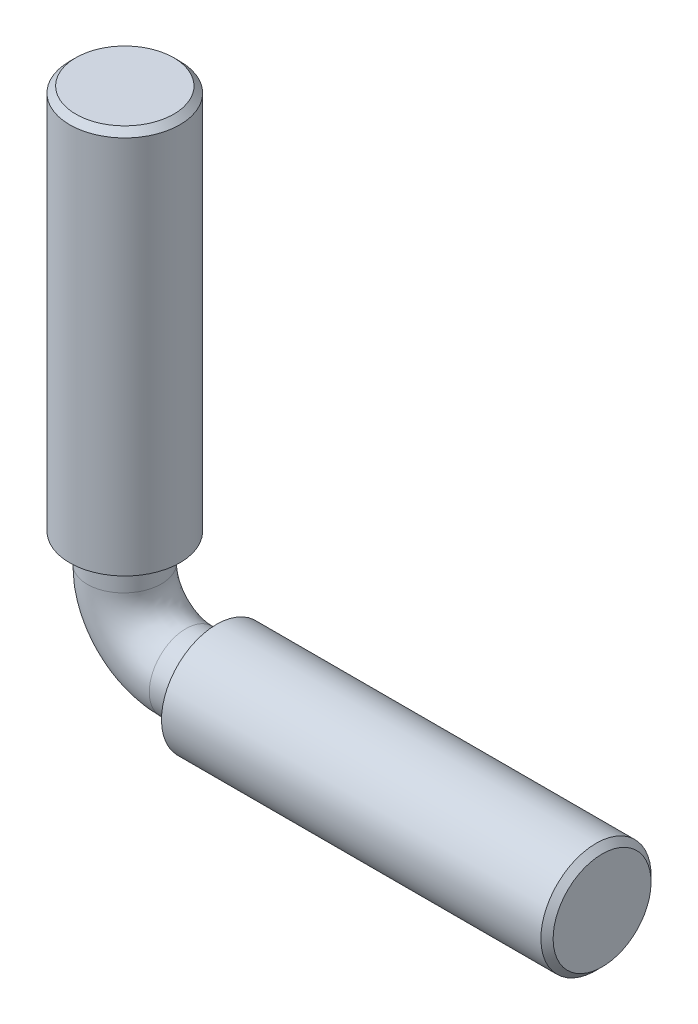
ISO-10303-21;
HEADER;
FILE_DESCRIPTION(('STEP AP214'),'2;1');
FILE_NAME('part.step','',(''),(''),'','','');
FILE_SCHEMA(('AUTOMOTIVE_DESIGN { 1 0 10303 214 1 1 1 1 }'));
ENDSEC;
DATA;
#1=APPLICATION_CONTEXT('core data for automotive mechanical design processes');
#2=APPLICATION_PROTOCOL_DEFINITION('international standard','automotive_design',2000,#1);
#3=PRODUCT_CONTEXT('',#1,'mechanical');
#4=PRODUCT('Part','Part','',(#3));
#5=PRODUCT_RELATED_PRODUCT_CATEGORY('part','',(#4));
#6=PRODUCT_DEFINITION_FORMATION('','',#4);
#7=PRODUCT_DEFINITION_CONTEXT('part definition',#1,'design');
#8=PRODUCT_DEFINITION('design','',#6,#7);
#9=PRODUCT_DEFINITION_SHAPE('','',#8);
#10=(LENGTH_UNIT() NAMED_UNIT(*) SI_UNIT(.MILLI.,.METRE.));
#11=(NAMED_UNIT(*) PLANE_ANGLE_UNIT() SI_UNIT($,.RADIAN.));
#12=(NAMED_UNIT(*) SI_UNIT($,.STERADIAN.) SOLID_ANGLE_UNIT());
#13=UNCERTAINTY_MEASURE_WITH_UNIT(LENGTH_MEASURE(1.E-05),#10,'distance_accuracy_value','');
#14=(GEOMETRIC_REPRESENTATION_CONTEXT(3) GLOBAL_UNCERTAINTY_ASSIGNED_CONTEXT((#13)) GLOBAL_UNIT_ASSIGNED_CONTEXT((#10,
#11,#12)) REPRESENTATION_CONTEXT('',''));
#15=CARTESIAN_POINT('',(0.,0.,0.));
#16=DIRECTION('',(0.,0.,1.));
#17=DIRECTION('',(1.,0.,0.));
#18=AXIS2_PLACEMENT_3D('',#15,#16,#17);
#19=CARTESIAN_POINT('',(-0.992744360204768,38.8467789270018,0.));
#20=DIRECTION('',(0.,-1.,0.));
#21=DIRECTION('',(0.,0.,-1.));
#22=AXIS2_PLACEMENT_3D('',#19,#20,#21);
#23=CYLINDRICAL_SURFACE('',#22,3.);
#24=CARTESIAN_POINT('',(-0.992744360204768,6.34677892700181,0.));
#25=DIRECTION('',(0.,1.,0.));
#26=DIRECTION('',(0.,0.,1.));
#27=AXIS2_PLACEMENT_3D('',#24,#25,#26);
#28=CIRCLE('',#27,3.);
#29=CARTESIAN_POINT('',(-0.992744360204768,6.34677892700181,3.));
#30=VERTEX_POINT('',#29);
#31=EDGE_CURVE('E64',#30,#30,#28,.F.);
#32=ORIENTED_EDGE('',*,*,#31,.T.);
#33=EDGE_LOOP('',(#32));
#34=FACE_BOUND('',#33,.T.);
#35=CARTESIAN_POINT('',(-0.996744360204768,5.046738923001,-3.));
#36=CARTESIAN_POINT('',(5.00205551977122,5.166738923001,-3.));
#37=CARTESIAN_POINT('',(5.00205551977122,5.166738923001,3.));
#38=CARTESIAN_POINT('',(-0.996744360204768,5.046738923001,3.));
#39=CARTESIAN_POINT('',(-6.99554424018076,4.92673892300101,3.));
#40=CARTESIAN_POINT('',(-6.99554424018076,4.92673892300101,-3.));
#41=CARTESIAN_POINT('',(-0.996744360204768,5.046738923001,-3.));
#42=(BOUNDED_CURVE() B_SPLINE_CURVE(3,(#35,#36,#37,#38,#39,#40,#41),.UNSPECIFIED.,.T.,
.F.) B_SPLINE_CURVE_WITH_KNOTS((4,3,4),(0.,0.5,1.),
.UNSPECIFIED.) CURVE() GEOMETRIC_REPRESENTATION_ITEM() RATIONAL_B_SPLINE_CURVE((1.,
0.333333333333333,0.333333333333333,1.,0.333333333333333,0.333333333333333,1.)) REPRESENTATION_ITEM(''));
#43=CARTESIAN_POINT('',(-0.996744360204768,5.046738923001,-3.));
#44=VERTEX_POINT('',#43);
#45=EDGE_CURVE('E81',#44,#44,#42,.T.);
#46=ORIENTED_EDGE('',*,*,#45,.F.);
#47=EDGE_LOOP('',(#46));
#48=FACE_BOUND('',#47,.T.);
#49=ADVANCED_FACE('F49',(#34,#48),#23,.T.);
#50=CARTESIAN_POINT('',(4.00625553977522,-0.0532210729981999,0.));
#51=DIRECTION('',(1.,0.,0.));
#52=DIRECTION('',(0.,0.,-1.));
#53=AXIS2_PLACEMENT_3D('',#50,#51,#52);
#54=CYLINDRICAL_SURFACE('',#53,3.);
#55=CARTESIAN_POINT('',(5.50625553977522,-0.0532210729981999,0.));
#56=DIRECTION('',(1.,0.,0.));
#57=DIRECTION('',(0.,1.,0.));
#58=AXIS2_PLACEMENT_3D('',#55,#56,#57);
#59=CIRCLE('',#58,3.);
#60=CARTESIAN_POINT('',(5.50625553977522,2.9467789270018,0.));
#61=VERTEX_POINT('',#60);
#62=EDGE_CURVE('E56',#61,#61,#59,.F.);
#63=ORIENTED_EDGE('',*,*,#62,.T.);
#64=EDGE_LOOP('',(#63));
#65=FACE_BOUND('',#64,.T.);
#66=CARTESIAN_POINT('',(4.00625553977522,-0.0532210729982008,0.));
#67=DIRECTION('',(1.,0.,0.));
#68=DIRECTION('',(0.,0.,-1.));
#69=AXIS2_PLACEMENT_3D('',#66,#67,#68);
#70=CIRCLE('',#69,3.);
#71=CARTESIAN_POINT('',(4.00625553977522,-0.0532210729982008,-3.));
#72=VERTEX_POINT('',#71);
#73=EDGE_CURVE('E85',#72,#72,#70,.T.);
#74=ORIENTED_EDGE('',*,*,#73,.T.);
#75=EDGE_LOOP('',(#74));
#76=FACE_BOUND('',#75,.T.);
#77=ADVANCED_FACE('F120',(#65,#76),#54,.T.);
#78=CARTESIAN_POINT('',(-0.996744360204768,5.046738923001,-3.));
#79=CARTESIAN_POINT('',(-0.996077693538109,5.01341225700087,-3.));
#80=CARTESIAN_POINT('',(-0.995411026871435,4.9800855910013,-3.));
#81=CARTESIAN_POINT('',(-0.994077693538102,4.9134322590015,-3.));
#82=CARTESIAN_POINT('',(-0.993412692236004,4.88010551171974,-3.));
#83=CARTESIAN_POINT('',(-0.992338417192119,4.82653645234937,-3.));
#84=CARTESIAN_POINT('',(-0.99181161526621,4.80629986845965,-3.));
#85=CARTESIAN_POINT('',(-0.99051052793411,4.76584104542199,-3.));
#86=CARTESIAN_POINT('',(-0.989737253905981,4.7456187564067,-3.));
#87=CARTESIAN_POINT('',(-0.987049702214601,4.68497671946215,-3.));
#88=CARTESIAN_POINT('',(-0.984767689786718,4.64458178020716,-3.));
#89=CARTESIAN_POINT('',(-0.976454543156447,4.52352462452086,-3.));
#90=CARTESIAN_POINT('',(-0.96895615855109,4.4429897814016,-3.));
#91=CARTESIAN_POINT('',(-0.94062654341767,4.20213307724187,-3.));
#92=CARTESIAN_POINT('',(-0.913956983318341,4.04255573665904,-3.));
#93=CARTESIAN_POINT('',(-0.810980769889759,3.56885376984692,-3.));
#94=CARTESIAN_POINT('',(-0.711621302984798,3.25976193540355,-3.));
#95=CARTESIAN_POINT('',(-0.327091327403664,2.37002556988227,-3.));
#96=CARTESIAN_POINT('',(0.0448025419734594,1.82837912246072,-3.));
#97=CARTESIAN_POINT('',(0.967708537576984,0.923750303000047,-3.));
#98=CARTESIAN_POINT('',(1.51730739543483,0.562341817213447,-3.));
#99=CARTESIAN_POINT('',(2.4152873986878,0.195636087349619,-3.));
#100=CARTESIAN_POINT('',(2.72647403433992,0.102554368346032,-3.));
#101=CARTESIAN_POINT('',(3.20195992093775,0.00924952183073729,-3.));
#102=CARTESIAN_POINT('',(3.36190581229895,-0.0141562965807287,-3.));
#103=CARTESIAN_POINT('',(3.60293939398161,-0.0375818447056896,-3.));
#104=CARTESIAN_POINT('',(3.68347065392838,-0.0434442577274419,-3.));
#105=CARTESIAN_POINT('',(3.80442525795303,-0.0493089341409013,-3.));
#106=CARTESIAN_POINT('',(3.84476982685467,-0.0507757101745176,-3.));
#107=CARTESIAN_POINT('',(3.90531170014163,-0.0522427610827665,-3.));
#108=CARTESIAN_POINT('',(3.92549650059518,-0.0526095940763061,-3.));
#109=CARTESIAN_POINT('',(3.96587209858892,-0.0530987499693647,-3.));
#110=CARTESIAN_POINT('',(3.98606289663431,-0.0532210729981999,-3.));
#111=CARTESIAN_POINT('',(4.00625553977522,-0.0532210729981999,-3.));
#112=CARTESIAN_POINT('',(5.00205551977122,5.166738923001,-3.));
#113=CARTESIAN_POINT('',(5.00272218643789,5.13341225700087,-3.));
#114=CARTESIAN_POINT('',(5.00338885310456,5.1000855910013,-3.));
#115=CARTESIAN_POINT('',(5.00472218643789,5.0334322590015,-3.));
#116=CARTESIAN_POINT('',(5.00578918617745,4.98010960965793,-3.));
#117=CARTESIAN_POINT('',(5.00621729005362,4.95868190751871,-3.));
#118=CARTESIAN_POINT('',(5.00586897078351,4.97487473871027,-3.));
#119=CARTESIAN_POINT('',(5.0056087533171,4.98296650331772,-3.));
#120=CARTESIAN_POINT('',(5.00545409851148,4.98701096112073,-3.));
#121=CARTESIAN_POINT('',(5.00491658817316,4.99913936850995,-3.));
#122=CARTESIAN_POINT('',(5.00446018568756,5.00721835636088,-3.));
#123=CARTESIAN_POINT('',(5.00279755636167,5.03142978749772,-3.));
#124=CARTESIAN_POINT('',(5.00129787944049,5.04753675612174,-3.));
#125=CARTESIAN_POINT('',(4.99563195641381,5.09570809695402,-3.));
#126=CARTESIAN_POINT('',(4.99029804439406,5.12762356507052,-3.));
#127=CARTESIAN_POINT('',(4.96970280170798,5.22236395843244,-3.));
#128=CARTESIAN_POINT('',(4.94983090832712,5.2841823253209,-3.));
#129=CARTESIAN_POINT('',(4.87292491321123,5.46212959842683,-3.));
#130=CARTESIAN_POINT('',(4.79854613933334,5.57045888791025,-3.));
#131=CARTESIAN_POINT('',(4.61396494021711,5.75138465180193,-3.));
#132=CARTESIAN_POINT('',(4.50404516864195,5.82366634896059,-3.));
#133=CARTESIAN_POINT('',(4.32444916799337,5.89700749493168,-3.));
#134=CARTESIAN_POINT('',(4.26221184086239,5.91562383873281,-3.));
#135=CARTESIAN_POINT('',(4.16711466354266,5.93428480803608,-3.));
#136=CARTESIAN_POINT('',(4.13512548527064,5.93896597171824,-3.));
#137=CARTESIAN_POINT('',(4.08691876893386,5.94365108134333,-3.));
#138=CARTESIAN_POINT('',(4.07081251694473,5.94482356394766,-3.));
#139=CARTESIAN_POINT('',(4.04662159613959,5.94599649923033,-3.));
#140=CARTESIAN_POINT('',(4.03855268235945,5.94628985443707,-3.));
#141=CARTESIAN_POINT('',(4.02644430770189,5.94658326461871,-3.));
#142=CARTESIAN_POINT('',(4.02240734761121,5.94665663121743,-3.));
#143=CARTESIAN_POINT('',(4.01433222801252,5.94675446239602,-3.));
#144=CARTESIAN_POINT('',(3.99817848251886,5.9467789270018,-3.));
#145=CARTESIAN_POINT('',(4.00625553977522,5.9467789270018,-3.));
#146=CARTESIAN_POINT('',(5.00205551977122,5.166738923001,3.));
#147=CARTESIAN_POINT('',(5.00272218643789,5.13341225700087,3.));
#148=CARTESIAN_POINT('',(5.00338885310456,5.1000855910013,3.));
#149=CARTESIAN_POINT('',(5.00472218643789,5.0334322590015,3.));
#150=CARTESIAN_POINT('',(5.00578918617745,4.98010960965793,3.));
#151=CARTESIAN_POINT('',(5.00621729005362,4.95868190751871,3.));
#152=CARTESIAN_POINT('',(5.00586897078351,4.97487473871027,3.));
#153=CARTESIAN_POINT('',(5.0056087533171,4.98296650331772,3.));
#154=CARTESIAN_POINT('',(5.00545409851148,4.98701096112073,3.));
#155=CARTESIAN_POINT('',(5.00491658817316,4.99913936850995,3.));
#156=CARTESIAN_POINT('',(5.00446018568758,5.00721835636088,3.));
#157=CARTESIAN_POINT('',(5.00279755636163,5.03142978749772,3.));
#158=CARTESIAN_POINT('',(5.00129787944049,5.04753675612174,3.));
#159=CARTESIAN_POINT('',(4.99563195641381,5.09570809695402,3.));
#160=CARTESIAN_POINT('',(4.99029804439406,5.12762356507052,3.));
#161=CARTESIAN_POINT('',(4.96970280170798,5.22236395843244,3.));
#162=CARTESIAN_POINT('',(4.94983090832712,5.2841823253209,3.));
#163=CARTESIAN_POINT('',(4.87292491321123,5.46212959842683,3.));
#164=CARTESIAN_POINT('',(4.79854613933334,5.57045888791025,3.));
#165=CARTESIAN_POINT('',(4.61396494021711,5.75138465180193,3.));
#166=CARTESIAN_POINT('',(4.50404516864195,5.82366634896059,3.));
#167=CARTESIAN_POINT('',(4.32444916799337,5.89700749493168,3.));
#168=CARTESIAN_POINT('',(4.26221184086239,5.91562383873281,3.));
#169=CARTESIAN_POINT('',(4.16711466354266,5.93428480803608,3.));
#170=CARTESIAN_POINT('',(4.13512548527064,5.93896597171824,3.));
#171=CARTESIAN_POINT('',(4.08691876893386,5.94365108134333,3.));
#172=CARTESIAN_POINT('',(4.07081251694473,5.94482356394766,3.));
#173=CARTESIAN_POINT('',(4.04662159613959,5.94599649923033,3.));
#174=CARTESIAN_POINT('',(4.03855268235945,5.94628985443707,3.));
#175=CARTESIAN_POINT('',(4.02644430770189,5.94658326461871,3.));
#176=CARTESIAN_POINT('',(4.02240734761121,5.94665663121743,3.));
#177=CARTESIAN_POINT('',(4.01433222801252,5.94675446239602,3.));
#178=CARTESIAN_POINT('',(3.99817848251886,5.9467789270018,3.));
#179=CARTESIAN_POINT('',(4.00625553977522,5.9467789270018,3.));
#180=CARTESIAN_POINT('',(-0.996744360204768,5.046738923001,3.));
#181=CARTESIAN_POINT('',(-0.996077693538109,5.01341225700087,3.));
#182=CARTESIAN_POINT('',(-0.995411026871434,4.9800855910013,3.));
#183=CARTESIAN_POINT('',(-0.994077693538102,4.9134322590015,3.));
#184=CARTESIAN_POINT('',(-0.993412692236003,4.88010551171974,3.));
#185=CARTESIAN_POINT('',(-0.992338417192119,4.82653645234937,3.));
#186=CARTESIAN_POINT('',(-0.991811615266205,4.80629986845965,3.));
#187=CARTESIAN_POINT('',(-0.990510527934114,4.76584104542199,3.));
#188=CARTESIAN_POINT('',(-0.989737253905981,4.7456187564067,3.));
#189=CARTESIAN_POINT('',(-0.987049702214601,4.68497671946215,3.));
#190=CARTESIAN_POINT('',(-0.9847676897867,4.64458178020716,3.));
#191=CARTESIAN_POINT('',(-0.976454543156482,4.52352462452086,3.));
#192=CARTESIAN_POINT('',(-0.968956158551089,4.4429897814016,3.));
#193=CARTESIAN_POINT('',(-0.940626543417669,4.20213307724187,3.));
#194=CARTESIAN_POINT('',(-0.913956983318341,4.04255573665904,3.));
#195=CARTESIAN_POINT('',(-0.810980769889759,3.56885376984692,3.));
#196=CARTESIAN_POINT('',(-0.711621302984798,3.25976193540355,3.));
#197=CARTESIAN_POINT('',(-0.327091327403664,2.37002556988227,3.));
#198=CARTESIAN_POINT('',(0.0448025419734629,1.82837912246072,3.));
#199=CARTESIAN_POINT('',(0.967708537576987,0.923750303000047,3.));
#200=CARTESIAN_POINT('',(1.51730739543483,0.562341817213447,3.));
#201=CARTESIAN_POINT('',(2.4152873986878,0.195636087349619,3.));
#202=CARTESIAN_POINT('',(2.72647403433992,0.102554368346032,3.));
#203=CARTESIAN_POINT('',(3.20195992093775,0.00924952183073729,3.));
#204=CARTESIAN_POINT('',(3.36190581229895,-0.0141562965807282,3.));
#205=CARTESIAN_POINT('',(3.60293939398161,-0.0375818447056892,3.));
#206=CARTESIAN_POINT('',(3.68347065392838,-0.0434442577274414,3.));
#207=CARTESIAN_POINT('',(3.80442525795303,-0.0493089341409008,3.));
#208=CARTESIAN_POINT('',(3.84476982685467,-0.0507757101745172,3.));
#209=CARTESIAN_POINT('',(3.90531170014163,-0.0522427610827661,3.));
#210=CARTESIAN_POINT('',(3.92549650059518,-0.0526095940763057,3.));
#211=CARTESIAN_POINT('',(3.96587209858892,-0.0530987499693642,3.));
#212=CARTESIAN_POINT('',(3.98606289663431,-0.0532210729981995,3.));
#213=CARTESIAN_POINT('',(4.00625553977522,-0.0532210729981995,3.));
#214=CARTESIAN_POINT('',(-6.99554424018076,4.92673892300101,3.));
#215=CARTESIAN_POINT('',(-6.99487757351411,4.89341225700088,3.));
#216=CARTESIAN_POINT('',(-6.99421090684743,4.86008559100131,3.));
#217=CARTESIAN_POINT('',(-6.9928775735141,4.79343225900151,3.));
#218=CARTESIAN_POINT('',(-6.99261457064946,4.78010141378154,3.));
#219=CARTESIAN_POINT('',(-6.99089412443786,4.69439099718004,3.));
#220=CARTESIAN_POINT('',(-6.98949220131592,4.63772499820902,3.));
#221=CARTESIAN_POINT('',(-6.98662980918532,4.54871558752626,3.));
#222=CARTESIAN_POINT('',(-6.98492860632344,4.50422655169267,3.));
#223=CARTESIAN_POINT('',(-6.97901599260237,4.37081407041435,3.));
#224=CARTESIAN_POINT('',(-6.97399556526098,4.28194520405343,3.));
#225=CARTESIAN_POINT('',(-6.95570664267459,4.01561946154402,3.));
#226=CARTESIAN_POINT('',(-6.93921019654267,3.83844280668146,3.));
#227=CARTESIAN_POINT('',(-6.87688504324914,3.30855805752972,3.));
#228=CARTESIAN_POINT('',(-6.81821201103074,2.95748790824755,3.));
#229=CARTESIAN_POINT('',(-6.5916643414875,1.9153435812614,3.));
#230=CARTESIAN_POINT('',(-6.37307351429671,1.2353415454862,3.));
#231=CARTESIAN_POINT('',(-5.52710756801855,-0.722078458662294,3.));
#232=CARTESIAN_POINT('',(-4.70894105538641,-1.91370064298882,3.));
#233=CARTESIAN_POINT('',(-2.67854786506314,-3.90388404580184,3.));
#234=CARTESIAN_POINT('',(-1.4694303777723,-4.6989827145337,3.));
#235=CARTESIAN_POINT('',(0.506125629382229,-5.50573532023244,3.));
#236=CARTESIAN_POINT('',(1.19073622781744,-5.71051510204075,3.));
#237=CARTESIAN_POINT('',(2.23680517833285,-5.91578576437461,3.));
#238=CARTESIAN_POINT('',(2.58868613932726,-5.9672785648797,3.));
#239=CARTESIAN_POINT('',(3.11896001902936,-6.01881477075471,3.));
#240=CARTESIAN_POINT('',(3.29612879091204,-6.03171207940255,3.));
#241=CARTESIAN_POINT('',(3.56222891976648,-6.04461436751213,3.));
#242=CARTESIAN_POINT('',(3.65098697134988,-6.0478412747861,3.));
#243=CARTESIAN_POINT('',(3.78417909258138,-6.05106878678424,3.));
#244=CARTESIAN_POINT('',(3.82858565357915,-6.05187581937005,3.));
#245=CARTESIAN_POINT('',(3.91741196916533,-6.05295196233475,3.));
#246=CARTESIAN_POINT('',(3.97394731074977,-6.0532210729982,3.));
#247=CARTESIAN_POINT('',(4.00625553977522,-6.0532210729982,3.));
#248=CARTESIAN_POINT('',(-6.99554424018076,4.92673892300101,-3.));
#249=CARTESIAN_POINT('',(-6.99487757351411,4.89341225700088,-3.));
#250=CARTESIAN_POINT('',(-6.99421090684743,4.86008559100131,-3.));
#251=CARTESIAN_POINT('',(-6.9928775735141,4.79343225900151,-3.));
#252=CARTESIAN_POINT('',(-6.99261457064946,4.78010141378154,-3.));
#253=CARTESIAN_POINT('',(-6.99089412443786,4.69439099718004,-3.));
#254=CARTESIAN_POINT('',(-6.98949220131593,4.63772499820902,-3.));
#255=CARTESIAN_POINT('',(-6.98662980918532,4.54871558752626,-3.));
#256=CARTESIAN_POINT('',(-6.98492860632344,4.50422655169267,-3.));
#257=CARTESIAN_POINT('',(-6.97901599260237,4.37081407041435,-3.));
#258=CARTESIAN_POINT('',(-6.973995565261,4.28194520405343,-3.));
#259=CARTESIAN_POINT('',(-6.95570664267456,4.01561946154402,-3.));
#260=CARTESIAN_POINT('',(-6.93921019654267,3.83844280668146,-3.));
#261=CARTESIAN_POINT('',(-6.87688504324914,3.30855805752972,-3.));
#262=CARTESIAN_POINT('',(-6.81821201103074,2.95748790824755,-3.));
#263=CARTESIAN_POINT('',(-6.5916643414875,1.9153435812614,-3.));
#264=CARTESIAN_POINT('',(-6.37307351429671,1.2353415454862,-3.));
#265=CARTESIAN_POINT('',(-5.52710756801855,-0.722078458662294,-3.));
#266=CARTESIAN_POINT('',(-4.70894105538641,-1.91370064298882,-3.));
#267=CARTESIAN_POINT('',(-2.67854786506314,-3.90388404580184,-3.));
#268=CARTESIAN_POINT('',(-1.4694303777723,-4.6989827145337,-3.));
#269=CARTESIAN_POINT('',(0.506125629382229,-5.50573532023244,-3.));
#270=CARTESIAN_POINT('',(1.19073622781744,-5.71051510204075,-3.));
#271=CARTESIAN_POINT('',(2.23680517833285,-5.91578576437461,-3.));
#272=CARTESIAN_POINT('',(2.58868613932726,-5.9672785648797,-3.));
#273=CARTESIAN_POINT('',(3.11896001902936,-6.01881477075471,-3.));
#274=CARTESIAN_POINT('',(3.29612879091204,-6.03171207940255,-3.));
#275=CARTESIAN_POINT('',(3.56222891976648,-6.04461436751213,-3.));
#276=CARTESIAN_POINT('',(3.65098697134988,-6.0478412747861,-3.));
#277=CARTESIAN_POINT('',(3.78417909258138,-6.05106878678424,-3.));
#278=CARTESIAN_POINT('',(3.82858565357915,-6.05187581937005,-3.));
#279=CARTESIAN_POINT('',(3.91741196916533,-6.05295196233475,-3.));
#280=CARTESIAN_POINT('',(3.97394731074977,-6.0532210729982,-3.));
#281=CARTESIAN_POINT('',(4.00625553977522,-6.0532210729982,-3.));
#282=CARTESIAN_POINT('',(-0.996744360204768,5.046738923001,-3.));
#283=CARTESIAN_POINT('',(-0.996077693538109,5.01341225700087,-3.));
#284=CARTESIAN_POINT('',(-0.995411026871435,4.9800855910013,-3.));
#285=CARTESIAN_POINT('',(-0.994077693538102,4.9134322590015,-3.));
#286=CARTESIAN_POINT('',(-0.993412692236004,4.88010551171974,-3.));
#287=CARTESIAN_POINT('',(-0.992338417192119,4.82653645234937,-3.));
#288=CARTESIAN_POINT('',(-0.99181161526621,4.80629986845965,-3.));
#289=CARTESIAN_POINT('',(-0.99051052793411,4.76584104542199,-3.));
#290=CARTESIAN_POINT('',(-0.989737253905981,4.7456187564067,-3.));
#291=CARTESIAN_POINT('',(-0.987049702214601,4.68497671946215,-3.));
#292=CARTESIAN_POINT('',(-0.984767689786718,4.64458178020716,-3.));
#293=CARTESIAN_POINT('',(-0.976454543156447,4.52352462452086,-3.));
#294=CARTESIAN_POINT('',(-0.96895615855109,4.4429897814016,-3.));
#295=CARTESIAN_POINT('',(-0.94062654341767,4.20213307724187,-3.));
#296=CARTESIAN_POINT('',(-0.913956983318341,4.04255573665904,-3.));
#297=CARTESIAN_POINT('',(-0.810980769889759,3.56885376984692,-3.));
#298=CARTESIAN_POINT('',(-0.711621302984798,3.25976193540355,-3.));
#299=CARTESIAN_POINT('',(-0.327091327403664,2.37002556988227,-3.));
#300=CARTESIAN_POINT('',(0.0448025419734594,1.82837912246072,-3.));
#301=CARTESIAN_POINT('',(0.967708537576984,0.923750303000047,-3.));
#302=CARTESIAN_POINT('',(1.51730739543483,0.562341817213447,-3.));
#303=CARTESIAN_POINT('',(2.4152873986878,0.195636087349619,-3.));
#304=CARTESIAN_POINT('',(2.72647403433992,0.102554368346032,-3.));
#305=CARTESIAN_POINT('',(3.20195992093775,0.00924952183073729,-3.));
#306=CARTESIAN_POINT('',(3.36190581229895,-0.0141562965807287,-3.));
#307=CARTESIAN_POINT('',(3.60293939398161,-0.0375818447056896,-3.));
#308=CARTESIAN_POINT('',(3.68347065392838,-0.0434442577274419,-3.));
#309=CARTESIAN_POINT('',(3.80442525795303,-0.0493089341409013,-3.));
#310=CARTESIAN_POINT('',(3.84476982685467,-0.0507757101745176,-3.));
#311=CARTESIAN_POINT('',(3.90531170014163,-0.0522427610827665,-3.));
#312=CARTESIAN_POINT('',(3.92549650059518,-0.0526095940763061,-3.));
#313=CARTESIAN_POINT('',(3.96587209858892,-0.0530987499693647,-3.));
#314=CARTESIAN_POINT('',(3.98606289663431,-0.0532210729981999,-3.));
#315=CARTESIAN_POINT('',(4.00625553977522,-0.0532210729981999,-3.));
#316=(BOUNDED_SURFACE() B_SPLINE_SURFACE(3,3,((#78,#79,#80,#81,#82,#83,#84,#85,#86,#87,#88,#89,
#90,#91,#92,#93,#94,#95,#96,#97,#98,#99,#100,#101,#102,#103,#104,#105,#106,#107,#108,#109,#110,
#111),(#112,#113,#114,#115,#116,#117,#118,#119,#120,#121,#122,#123,#124,#125,#126,#127,#128,
#129,#130,#131,#132,#133,#134,#135,#136,#137,#138,#139,#140,#141,#142,#143,#144,#145),(#146,
#147,#148,#149,#150,#151,#152,#153,#154,#155,#156,#157,#158,#159,#160,#161,#162,#163,#164,#165,
#166,#167,#168,#169,#170,#171,#172,#173,#174,#175,#176,#177,#178,#179),(#180,#181,#182,#183,
#184,#185,#186,#187,#188,#189,#190,#191,#192,#193,#194,#195,#196,#197,#198,#199,#200,#201,#202,
#203,#204,#205,#206,#207,#208,#209,#210,#211,#212,#213),(#214,#215,#216,#217,#218,#219,#220,
#221,#222,#223,#224,#225,#226,#227,#228,#229,#230,#231,#232,#233,#234,#235,#236,#237,#238,#239,
#240,#241,#242,#243,#244,#245,#246,#247),(#248,#249,#250,#251,#252,#253,#254,#255,#256,#257,
#258,#259,#260,#261,#262,#263,#264,#265,#266,#267,#268,#269,#270,#271,#272,#273,#274,#275,#276,
#277,#278,#279,#280,#281),(#282,#283,#284,#285,#286,#287,#288,#289,#290,#291,#292,#293,#294,
#295,#296,#297,#298,#299,#300,#301,#302,#303,#304,#305,#306,#307,#308,#309,#310,#311,#312,#313,
#314,#315)),.UNSPECIFIED.,.T.,.F.,.F.) B_SPLINE_SURFACE_WITH_KNOTS((4,3,4),(4,2,2,2,2,2,2,2,2,2,
2,2,2,2,2,2,4),(0.,0.5,1.),(-0.00477720413698505,-0.00238860206849252,0.,0.00145083023764533,
0.00290166047529067,0.00580332095058133,0.0116066419011627,0.0232132838023253,
0.0464265676046507,0.0928531352093014,0.139279702813952,0.162492986616277,0.17409962851744,
0.179902949468021,0.182804609943312,0.184255440180957,0.185706270418603),
.UNSPECIFIED.) GEOMETRIC_REPRESENTATION_ITEM() RATIONAL_B_SPLINE_SURFACE(((1.,1.,1.,1.,1.,1.,1.,
1.,1.,1.,1.,1.,1.,1.,1.,1.,1.,1.,1.,1.,1.,1.,1.,1.,1.,1.,1.,1.,1.,1.,1.,1.,1.,1.),
(0.333333333333333,0.333333333333333,0.333333333333333,0.333333333333333,0.333333333333333,
0.333333333333333,0.333333333333333,0.333333333333333,0.333333333333333,0.333333333333333,
0.333333333333333,0.333333333333333,0.333333333333333,0.333333333333333,0.333333333333333,
0.333333333333333,0.333333333333333,0.333333333333333,0.333333333333333,0.333333333333333,
0.333333333333333,0.333333333333333,0.333333333333333,0.333333333333333,0.333333333333333,
0.333333333333333,0.333333333333333,0.333333333333333,0.333333333333333,0.333333333333333,
0.333333333333333,0.333333333333333,0.333333333333333,0.333333333333333),(0.333333333333333,
0.333333333333333,0.333333333333333,0.333333333333333,0.333333333333333,0.333333333333333,
0.333333333333333,0.333333333333333,0.333333333333333,0.333333333333333,0.333333333333333,
0.333333333333333,0.333333333333333,0.333333333333333,0.333333333333333,0.333333333333333,
0.333333333333333,0.333333333333333,0.333333333333333,0.333333333333333,0.333333333333333,
0.333333333333333,0.333333333333333,0.333333333333333,0.333333333333333,0.333333333333333,
0.333333333333333,0.333333333333333,0.333333333333333,0.333333333333333,0.333333333333333,
0.333333333333333,0.333333333333333,0.333333333333333),(1.,1.,1.,1.,1.,1.,1.,1.,1.,1.,1.,1.,1.,
1.,1.,1.,1.,1.,1.,1.,1.,1.,1.,1.,1.,1.,1.,1.,1.,1.,1.,1.,1.,1.),(0.333333333333333,
0.333333333333333,0.333333333333333,0.333333333333333,0.333333333333333,0.333333333333333,
0.333333333333333,0.333333333333333,0.333333333333333,0.333333333333333,0.333333333333333,
0.333333333333333,0.333333333333333,0.333333333333333,0.333333333333333,0.333333333333333,
0.333333333333333,0.333333333333333,0.333333333333333,0.333333333333333,0.333333333333333,
0.333333333333333,0.333333333333333,0.333333333333333,0.333333333333333,0.333333333333333,
0.333333333333333,0.333333333333333,0.333333333333333,0.333333333333333,0.333333333333333,
0.333333333333333,0.333333333333333,0.333333333333333),(0.333333333333333,0.333333333333333,
0.333333333333333,0.333333333333333,0.333333333333333,0.333333333333333,0.333333333333333,
0.333333333333333,0.333333333333333,0.333333333333333,0.333333333333333,0.333333333333333,
0.333333333333333,0.333333333333333,0.333333333333333,0.333333333333333,0.333333333333333,
0.333333333333333,0.333333333333333,0.333333333333333,0.333333333333333,0.333333333333333,
0.333333333333333,0.333333333333333,0.333333333333333,0.333333333333333,0.333333333333333,
0.333333333333333,0.333333333333333,0.333333333333333,0.333333333333333,0.333333333333333,
0.333333333333333,0.333333333333333),(1.,1.,1.,1.,1.,1.,1.,1.,1.,1.,1.,1.,1.,1.,1.,1.,1.,1.,1.,
1.,1.,1.,1.,1.,1.,1.,1.,1.,1.,1.,1.,1.,1.,1.))) REPRESENTATION_ITEM('') SURFACE());
#317=ORIENTED_EDGE('',*,*,#73,.F.);
#318=EDGE_LOOP('',(#317));
#319=FACE_BOUND('',#318,.T.);
#320=ORIENTED_EDGE('',*,*,#45,.T.);
#321=EDGE_LOOP('',(#320));
#322=FACE_BOUND('',#321,.T.);
#323=ADVANCED_FACE('F108',(#319,#322),#316,.T.);
#324=CARTESIAN_POINT('',(6.50625553977522,0.,0.));
#325=DIRECTION('',(1.,0.,0.));
#326=DIRECTION('',(0.,1.,0.));
#327=AXIS2_PLACEMENT_3D('',#324,#325,#326);
#328=CYLINDRICAL_SURFACE('',#327,4.5);
#329=CARTESIAN_POINT('',(37.5062555397752,0.,0.));
#330=DIRECTION('',(1.,0.,0.));
#331=DIRECTION('',(0.,1.,0.));
#332=AXIS2_PLACEMENT_3D('',#329,#330,#331);
#333=CIRCLE('',#332,4.5);
#334=CARTESIAN_POINT('',(37.5062555397752,4.5,0.));
#335=VERTEX_POINT('',#334);
#336=EDGE_CURVE('E75',#335,#335,#333,.F.);
#337=ORIENTED_EDGE('',*,*,#336,.T.);
#338=EDGE_LOOP('',(#337));
#339=FACE_BOUND('',#338,.T.);
#340=CARTESIAN_POINT('',(6.50625553977522,0.,0.));
#341=DIRECTION('',(1.,0.,0.));
#342=DIRECTION('',(0.,1.,0.));
#343=AXIS2_PLACEMENT_3D('',#340,#341,#342);
#344=CIRCLE('',#343,4.5);
#345=CARTESIAN_POINT('',(6.50625553977522,4.5,0.));
#346=VERTEX_POINT('',#345);
#347=EDGE_CURVE('E92',#346,#346,#344,.T.);
#348=ORIENTED_EDGE('',*,*,#347,.T.);
#349=EDGE_LOOP('',(#348));
#350=FACE_BOUND('',#349,.T.);
#351=ADVANCED_FACE('F119',(#339,#350),#328,.T.);
#352=CARTESIAN_POINT('',(6.50625553977522,0.,0.));
#353=DIRECTION('',(1.,0.,0.));
#354=DIRECTION('',(0.,1.,0.));
#355=AXIS2_PLACEMENT_3D('',#352,#353,#354);
#356=PLANE('',#355);
#357=CARTESIAN_POINT('',(6.50625553977522,-0.0532210729981999,0.));
#358=DIRECTION('',(1.,0.,0.));
#359=DIRECTION('',(0.,1.,0.));
#360=AXIS2_PLACEMENT_3D('',#357,#358,#359);
#361=CIRCLE('',#360,4.);
#362=CARTESIAN_POINT('',(6.50625553977522,3.9467789270018,0.));
#363=VERTEX_POINT('',#362);
#364=EDGE_CURVE('E11',#363,#363,#361,.T.);
#365=ORIENTED_EDGE('',*,*,#364,.T.);
#366=EDGE_LOOP('',(#365));
#367=FACE_BOUND('',#366,.T.);
#368=ORIENTED_EDGE('',*,*,#347,.F.);
#369=EDGE_LOOP('',(#368));
#370=FACE_BOUND('',#369,.T.);
#371=ADVANCED_FACE('F179',(#367,#370),#356,.F.);
#372=CARTESIAN_POINT('',(38.0062555397752,-0.0532210729981999,0.));
#373=DIRECTION('',(1.,0.,0.));
#374=DIRECTION('',(0.,0.,-1.));
#375=AXIS2_PLACEMENT_3D('',#372,#373,#374);
#376=PLANE('',#375);
#377=CARTESIAN_POINT('',(38.0062555397752,0.,0.));
#378=DIRECTION('',(1.,0.,0.));
#379=DIRECTION('',(0.,1.,0.));
#380=AXIS2_PLACEMENT_3D('',#377,#378,#379);
#381=CIRCLE('',#380,3.99999999999999);
#382=CARTESIAN_POINT('',(38.0062555397752,3.99999999999999,0.));
#383=VERTEX_POINT('',#382);
#384=EDGE_CURVE('E78',#383,#383,#381,.T.);
#385=ORIENTED_EDGE('',*,*,#384,.T.);
#386=EDGE_LOOP('',(#385));
#387=FACE_BOUND('',#386,.T.);
#388=ADVANCED_FACE('F176',(#387),#376,.T.);
#389=CARTESIAN_POINT('',(-0.992744360204768,7.34677892700181,0.));
#390=DIRECTION('',(0.,1.,0.));
#391=DIRECTION('',(0.,0.,1.));
#392=AXIS2_PLACEMENT_3D('',#389,#390,#391);
#393=CYLINDRICAL_SURFACE('',#392,4.5);
#394=CARTESIAN_POINT('',(-0.992744360204768,38.3467789270018,0.));
#395=DIRECTION('',(0.,-1.,0.));
#396=DIRECTION('',(0.,0.,-1.));
#397=AXIS2_PLACEMENT_3D('',#394,#395,#396);
#398=CIRCLE('',#397,4.5);
#399=CARTESIAN_POINT('',(-0.992744360204768,38.3467789270018,-4.5));
#400=VERTEX_POINT('',#399);
#401=EDGE_CURVE('E69',#400,#400,#398,.T.);
#402=ORIENTED_EDGE('',*,*,#401,.T.);
#403=EDGE_LOOP('',(#402));
#404=FACE_BOUND('',#403,.T.);
#405=CARTESIAN_POINT('',(-0.992744360204768,7.34677892700181,0.));
#406=DIRECTION('',(0.,1.,0.));
#407=DIRECTION('',(0.,0.,1.));
#408=AXIS2_PLACEMENT_3D('',#405,#406,#407);
#409=CIRCLE('',#408,4.5);
#410=CARTESIAN_POINT('',(-0.992744360204768,7.34677892700181,4.5));
#411=VERTEX_POINT('',#410);
#412=EDGE_CURVE('E208',#411,#411,#409,.T.);
#413=ORIENTED_EDGE('',*,*,#412,.T.);
#414=EDGE_LOOP('',(#413));
#415=FACE_BOUND('',#414,.T.);
#416=ADVANCED_FACE('F178',(#404,#415),#393,.T.);
#417=CARTESIAN_POINT('',(-0.992744360204768,7.34677892700181,0.));
#418=DIRECTION('',(0.,1.,0.));
#419=DIRECTION('',(0.,0.,1.));
#420=AXIS2_PLACEMENT_3D('',#417,#418,#419);
#421=PLANE('',#420);
#422=CARTESIAN_POINT('',(-0.992744360204768,7.34677892700181,0.));
#423=DIRECTION('',(0.,1.,0.));
#424=DIRECTION('',(0.,0.,1.));
#425=AXIS2_PLACEMENT_3D('',#422,#423,#424);
#426=CIRCLE('',#425,4.);
#427=CARTESIAN_POINT('',(-0.992744360204768,7.34677892700181,4.));
#428=VERTEX_POINT('',#427);
#429=EDGE_CURVE('E60',#428,#428,#426,.T.);
#430=ORIENTED_EDGE('',*,*,#429,.T.);
#431=EDGE_LOOP('',(#430));
#432=FACE_BOUND('',#431,.T.);
#433=ORIENTED_EDGE('',*,*,#412,.F.);
#434=EDGE_LOOP('',(#433));
#435=FACE_BOUND('',#434,.T.);
#436=ADVANCED_FACE('F182',(#432,#435),#421,.F.);
#437=CARTESIAN_POINT('',(-0.992744360204768,38.8467789270018,0.));
#438=DIRECTION('',(0.,-1.,0.));
#439=DIRECTION('',(0.,0.,-1.));
#440=AXIS2_PLACEMENT_3D('',#437,#438,#439);
#441=PLANE('',#440);
#442=CARTESIAN_POINT('',(-0.992744360204768,38.8467789270018,0.));
#443=DIRECTION('',(0.,-1.,0.));
#444=DIRECTION('',(0.,0.,-1.));
#445=AXIS2_PLACEMENT_3D('',#442,#443,#444);
#446=CIRCLE('',#445,3.99999999999999);
#447=CARTESIAN_POINT('',(-0.992744360204768,38.8467789270018,-3.99999999999999));
#448=VERTEX_POINT('',#447);
#449=EDGE_CURVE('E72',#448,#448,#446,.F.);
#450=ORIENTED_EDGE('',*,*,#449,.T.);
#451=EDGE_LOOP('',(#450));
#452=FACE_BOUND('',#451,.T.);
#453=ADVANCED_FACE('F174',(#452),#441,.F.);
#454=CARTESIAN_POINT('',(38.0062555397752,0.,0.));
#455=DIRECTION('',(-1.,0.,0.));
#456=DIRECTION('',(0.,-1.,0.));
#457=AXIS2_PLACEMENT_3D('',#454,#455,#456);
#458=CONICAL_SURFACE('',#457,3.99999999999999,0.785398163397444);
#459=ORIENTED_EDGE('',*,*,#336,.F.);
#460=EDGE_LOOP('',(#459));
#461=FACE_BOUND('',#460,.T.);
#462=ORIENTED_EDGE('',*,*,#384,.F.);
#463=EDGE_LOOP('',(#462));
#464=FACE_BOUND('',#463,.T.);
#465=ADVANCED_FACE('F161',(#461,#464),#458,.T.);
#466=CARTESIAN_POINT('',(-0.992744360204768,38.8467789270018,0.));
#467=DIRECTION('',(0.,-1.,0.));
#468=DIRECTION('',(0.,0.,-1.));
#469=AXIS2_PLACEMENT_3D('',#466,#467,#468);
#470=CONICAL_SURFACE('',#469,3.99999999999999,0.785398163397444);
#471=ORIENTED_EDGE('',*,*,#401,.F.);
#472=EDGE_LOOP('',(#471));
#473=FACE_BOUND('',#472,.T.);
#474=ORIENTED_EDGE('',*,*,#449,.F.);
#475=EDGE_LOOP('',(#474));
#476=FACE_BOUND('',#475,.T.);
#477=ADVANCED_FACE('F154',(#473,#476),#470,.T.);
#478=CARTESIAN_POINT('',(-0.992744360204768,6.34677892700181,0.));
#479=DIRECTION('',(0.,1.,0.));
#480=DIRECTION('',(0.,0.,1.));
#481=AXIS2_PLACEMENT_3D('',#478,#479,#480);
#482=TOROIDAL_SURFACE('',#481,4.,1.);
#483=ORIENTED_EDGE('',*,*,#429,.F.);
#484=EDGE_LOOP('',(#483));
#485=FACE_BOUND('',#484,.T.);
#486=ORIENTED_EDGE('',*,*,#31,.F.);
#487=EDGE_LOOP('',(#486));
#488=FACE_BOUND('',#487,.T.);
#489=ADVANCED_FACE('F152',(#485,#488),#482,.F.);
#490=CARTESIAN_POINT('',(5.50625553977522,-0.0532210729981999,0.));
#491=DIRECTION('',(1.,0.,0.));
#492=DIRECTION('',(0.,1.,0.));
#493=AXIS2_PLACEMENT_3D('',#490,#491,#492);
#494=TOROIDAL_SURFACE('',#493,4.,1.);
#495=ORIENTED_EDGE('',*,*,#364,.F.);
#496=EDGE_LOOP('',(#495));
#497=FACE_BOUND('',#496,.T.);
#498=ORIENTED_EDGE('',*,*,#62,.F.);
#499=EDGE_LOOP('',(#498));
#500=FACE_BOUND('',#499,.T.);
#501=ADVANCED_FACE('F51',(#497,#500),#494,.F.);
#502=CLOSED_SHELL('',(#49,#77,#323,#351,#371,#388,#416,#436,#453,#465,#477,#489,#501));
#503=MANIFOLD_SOLID_BREP('B2',#502);
#504=ADVANCED_BREP_SHAPE_REPRESENTATION('',(#18,#503),#14);
#505=SHAPE_DEFINITION_REPRESENTATION(#9,#504);
ENDSEC;
END-ISO-10303-21;
